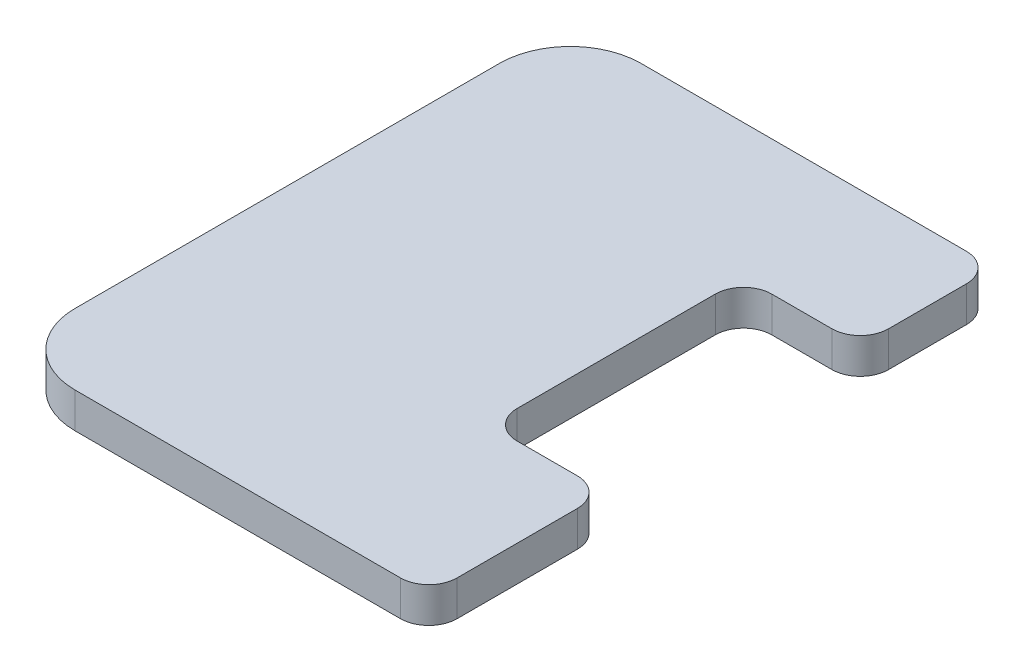
ISO-10303-21;
HEADER;
FILE_DESCRIPTION(('STEP AP214'),'2;1');
FILE_NAME('part.step','',(''),(''),'','','');
FILE_SCHEMA(('AUTOMOTIVE_DESIGN { 1 0 10303 214 1 1 1 1 }'));
ENDSEC;
DATA;
#1=APPLICATION_CONTEXT('core data for automotive mechanical design processes');
#2=APPLICATION_PROTOCOL_DEFINITION('international standard','automotive_design',2000,#1);
#3=PRODUCT_CONTEXT('',#1,'mechanical');
#4=PRODUCT('Part','Part','',(#3));
#5=PRODUCT_RELATED_PRODUCT_CATEGORY('part','',(#4));
#6=PRODUCT_DEFINITION_FORMATION('','',#4);
#7=PRODUCT_DEFINITION_CONTEXT('part definition',#1,'design');
#8=PRODUCT_DEFINITION('design','',#6,#7);
#9=PRODUCT_DEFINITION_SHAPE('','',#8);
#10=(LENGTH_UNIT() NAMED_UNIT(*) SI_UNIT(.MILLI.,.METRE.));
#11=(NAMED_UNIT(*) PLANE_ANGLE_UNIT() SI_UNIT($,.RADIAN.));
#12=(NAMED_UNIT(*) SI_UNIT($,.STERADIAN.) SOLID_ANGLE_UNIT());
#13=UNCERTAINTY_MEASURE_WITH_UNIT(LENGTH_MEASURE(1.E-05),#10,'distance_accuracy_value','');
#14=(GEOMETRIC_REPRESENTATION_CONTEXT(3) GLOBAL_UNCERTAINTY_ASSIGNED_CONTEXT((#13)) GLOBAL_UNIT_ASSIGNED_CONTEXT((#10,
#11,#12)) REPRESENTATION_CONTEXT('',''));
#15=CARTESIAN_POINT('',(0.,0.,0.));
#16=DIRECTION('',(0.,0.,1.));
#17=DIRECTION('',(1.,0.,0.));
#18=AXIS2_PLACEMENT_3D('',#15,#16,#17);
#19=CARTESIAN_POINT('',(19.05,3.175,25.4));
#20=DIRECTION('',(-1.,0.,0.));
#21=DIRECTION('',(0.,0.,1.));
#22=AXIS2_PLACEMENT_3D('',#19,#20,#21);
#23=PLANE('',#22);
#24=DIRECTION('',(0.,0.,-1.));
#25=VECTOR('',#24,1.);
#26=CARTESIAN_POINT('',(19.05,3.175,25.4));
#27=LINE('',#26,#25);
#28=CARTESIAN_POINT('',(19.05,3.175,22.86));
#29=VERTEX_POINT('',#28);
#30=CARTESIAN_POINT('',(19.05,3.175,12.065));
#31=VERTEX_POINT('',#30);
#32=EDGE_CURVE('E211',#29,#31,#27,.T.);
#33=ORIENTED_EDGE('',*,*,#32,.F.);
#34=DIRECTION('',(0.,-1.,0.));
#35=VECTOR('',#34,1.);
#36=CARTESIAN_POINT('',(19.05,3.175,22.86));
#37=LINE('',#36,#35);
#38=CARTESIAN_POINT('',(19.05,0.,22.86));
#39=VERTEX_POINT('',#38);
#40=EDGE_CURVE('E195',#29,#39,#37,.T.);
#41=ORIENTED_EDGE('',*,*,#40,.T.);
#42=DIRECTION('',(0.,0.,-1.));
#43=VECTOR('',#42,1.);
#44=CARTESIAN_POINT('',(19.05,0.,25.4));
#45=LINE('',#44,#43);
#46=CARTESIAN_POINT('',(19.05,0.,12.065));
#47=VERTEX_POINT('',#46);
#48=EDGE_CURVE('E208',#39,#47,#45,.T.);
#49=ORIENTED_EDGE('',*,*,#48,.T.);
#50=DIRECTION('',(0.,1.,0.));
#51=VECTOR('',#50,1.);
#52=CARTESIAN_POINT('',(19.05,3.175,12.065));
#53=LINE('',#52,#51);
#54=EDGE_CURVE('E214',#47,#31,#53,.T.);
#55=ORIENTED_EDGE('',*,*,#54,.T.);
#56=EDGE_LOOP('',(#33,#41,#49,#55));
#57=FACE_BOUND('',#56,.T.);
#58=ADVANCED_FACE('F48',(#57),#23,.F.);
#59=CARTESIAN_POINT('',(19.05,0.,-15.875));
#60=VERTEX_POINT('',#59);
#61=CARTESIAN_POINT('',(19.05,0.,-22.86));
#62=VERTEX_POINT('',#61);
#63=EDGE_CURVE('E222',#60,#62,#45,.T.);
#64=ORIENTED_EDGE('',*,*,#63,.T.);
#65=DIRECTION('',(0.,-1.,0.));
#66=VECTOR('',#65,1.);
#67=CARTESIAN_POINT('',(19.05,3.175,-22.86));
#68=LINE('',#67,#66);
#69=CARTESIAN_POINT('',(19.05,3.175,-22.86));
#70=VERTEX_POINT('',#69);
#71=EDGE_CURVE('E269',#62,#70,#68,.F.);
#72=ORIENTED_EDGE('',*,*,#71,.T.);
#73=CARTESIAN_POINT('',(19.05,3.175,-15.875));
#74=VERTEX_POINT('',#73);
#75=EDGE_CURVE('E239',#74,#70,#27,.T.);
#76=ORIENTED_EDGE('',*,*,#75,.F.);
#77=DIRECTION('',(0.,1.,0.));
#78=VECTOR('',#77,1.);
#79=CARTESIAN_POINT('',(19.05,3.175,-15.875));
#80=LINE('',#79,#78);
#81=EDGE_CURVE('E266',#74,#60,#80,.F.);
#82=ORIENTED_EDGE('',*,*,#81,.T.);
#83=EDGE_LOOP('',(#64,#72,#76,#82));
#84=FACE_BOUND('',#83,.T.);
#85=ADVANCED_FACE('F351',(#84),#23,.F.);
#86=CARTESIAN_POINT('',(-19.05,3.175,-25.4));
#87=DIRECTION('',(0.,0.,1.));
#88=DIRECTION('',(1.,0.,0.));
#89=AXIS2_PLACEMENT_3D('',#86,#87,#88);
#90=PLANE('',#89);
#91=DIRECTION('',(-1.,0.,0.));
#92=VECTOR('',#91,1.);
#93=CARTESIAN_POINT('',(-19.05,0.,-25.4));
#94=LINE('',#93,#92);
#95=CARTESIAN_POINT('',(16.51,0.,-25.4));
#96=VERTEX_POINT('',#95);
#97=CARTESIAN_POINT('',(-12.7,0.,-25.4));
#98=VERTEX_POINT('',#97);
#99=EDGE_CURVE('E221',#96,#98,#94,.T.);
#100=ORIENTED_EDGE('',*,*,#99,.T.);
#101=DIRECTION('',(0.,-1.,0.));
#102=VECTOR('',#101,1.);
#103=CARTESIAN_POINT('',(-12.7,3.175,-25.4));
#104=LINE('',#103,#102);
#105=CARTESIAN_POINT('',(-12.7,3.175,-25.4));
#106=VERTEX_POINT('',#105);
#107=EDGE_CURVE('E11',#98,#106,#104,.F.);
#108=ORIENTED_EDGE('',*,*,#107,.T.);
#109=DIRECTION('',(-1.,0.,0.));
#110=VECTOR('',#109,1.);
#111=CARTESIAN_POINT('',(-19.05,3.175,-25.4));
#112=LINE('',#111,#110);
#113=CARTESIAN_POINT('',(16.51,3.175,-25.4));
#114=VERTEX_POINT('',#113);
#115=EDGE_CURVE('E343',#114,#106,#112,.T.);
#116=ORIENTED_EDGE('',*,*,#115,.F.);
#117=DIRECTION('',(0.,-1.,0.));
#118=VECTOR('',#117,1.);
#119=CARTESIAN_POINT('',(16.51,3.175,-25.4));
#120=LINE('',#119,#118);
#121=EDGE_CURVE('E262',#114,#96,#120,.T.);
#122=ORIENTED_EDGE('',*,*,#121,.T.);
#123=EDGE_LOOP('',(#100,#108,#116,#122));
#124=FACE_BOUND('',#123,.T.);
#125=ADVANCED_FACE('F341',(#124),#90,.F.);
#126=CARTESIAN_POINT('',(-19.05,3.175,25.4));
#127=DIRECTION('',(1.,0.,0.));
#128=DIRECTION('',(0.,0.,-1.));
#129=AXIS2_PLACEMENT_3D('',#126,#127,#128);
#130=PLANE('',#129);
#131=DIRECTION('',(0.,0.,1.));
#132=VECTOR('',#131,1.);
#133=CARTESIAN_POINT('',(-19.05,0.,25.4));
#134=LINE('',#133,#132);
#135=CARTESIAN_POINT('',(-19.05,0.,-19.05));
#136=VERTEX_POINT('',#135);
#137=CARTESIAN_POINT('',(-19.05,0.,19.05));
#138=VERTEX_POINT('',#137);
#139=EDGE_CURVE('E226',#136,#138,#134,.T.);
#140=ORIENTED_EDGE('',*,*,#139,.T.);
#141=DIRECTION('',(0.,-1.,0.));
#142=VECTOR('',#141,1.);
#143=CARTESIAN_POINT('',(-19.05,3.175,19.05));
#144=LINE('',#143,#142);
#145=CARTESIAN_POINT('',(-19.05,3.175,19.05));
#146=VERTEX_POINT('',#145);
#147=EDGE_CURVE('E73',#138,#146,#144,.F.);
#148=ORIENTED_EDGE('',*,*,#147,.T.);
#149=DIRECTION('',(0.,0.,1.));
#150=VECTOR('',#149,1.);
#151=CARTESIAN_POINT('',(-19.05,3.175,25.4));
#152=LINE('',#151,#150);
#153=CARTESIAN_POINT('',(-19.05,3.175,-19.05));
#154=VERTEX_POINT('',#153);
#155=EDGE_CURVE('E328',#154,#146,#152,.T.);
#156=ORIENTED_EDGE('',*,*,#155,.F.);
#157=DIRECTION('',(0.,-1.,0.));
#158=VECTOR('',#157,1.);
#159=CARTESIAN_POINT('',(-19.05,3.175,-19.05));
#160=LINE('',#159,#158);
#161=EDGE_CURVE('E315',#154,#136,#160,.T.);
#162=ORIENTED_EDGE('',*,*,#161,.T.);
#163=EDGE_LOOP('',(#140,#148,#156,#162));
#164=FACE_BOUND('',#163,.T.);
#165=ADVANCED_FACE('F336',(#164),#130,.F.);
#166=CARTESIAN_POINT('',(-19.05,3.175,25.4));
#167=DIRECTION('',(0.,0.,-1.));
#168=DIRECTION('',(-1.,0.,0.));
#169=AXIS2_PLACEMENT_3D('',#166,#167,#168);
#170=PLANE('',#169);
#171=DIRECTION('',(1.,0.,0.));
#172=VECTOR('',#171,1.);
#173=CARTESIAN_POINT('',(-19.05,3.175,25.4));
#174=LINE('',#173,#172);
#175=CARTESIAN_POINT('',(-12.7,3.175,25.4));
#176=VERTEX_POINT('',#175);
#177=CARTESIAN_POINT('',(16.51,3.175,25.4));
#178=VERTEX_POINT('',#177);
#179=EDGE_CURVE('E231',#176,#178,#174,.T.);
#180=ORIENTED_EDGE('',*,*,#179,.F.);
#181=DIRECTION('',(0.,-1.,0.));
#182=VECTOR('',#181,1.);
#183=CARTESIAN_POINT('',(-12.7,3.175,25.4));
#184=LINE('',#183,#182);
#185=CARTESIAN_POINT('',(-12.7,0.,25.4));
#186=VERTEX_POINT('',#185);
#187=EDGE_CURVE('E305',#176,#186,#184,.T.);
#188=ORIENTED_EDGE('',*,*,#187,.T.);
#189=DIRECTION('',(1.,0.,0.));
#190=VECTOR('',#189,1.);
#191=CARTESIAN_POINT('',(-19.05,0.,25.4));
#192=LINE('',#191,#190);
#193=CARTESIAN_POINT('',(16.51,0.,25.4));
#194=VERTEX_POINT('',#193);
#195=EDGE_CURVE('E236',#186,#194,#192,.T.);
#196=ORIENTED_EDGE('',*,*,#195,.T.);
#197=DIRECTION('',(0.,-1.,0.));
#198=VECTOR('',#197,1.);
#199=CARTESIAN_POINT('',(16.51,3.175,25.4));
#200=LINE('',#199,#198);
#201=EDGE_CURVE('E197',#194,#178,#200,.F.);
#202=ORIENTED_EDGE('',*,*,#201,.T.);
#203=EDGE_LOOP('',(#180,#188,#196,#202));
#204=FACE_BOUND('',#203,.T.);
#205=ADVANCED_FACE('F332',(#204),#170,.F.);
#206=CARTESIAN_POINT('',(0.,3.175,0.));
#207=DIRECTION('',(0.,-1.,0.));
#208=DIRECTION('',(0.,0.,-1.));
#209=AXIS2_PLACEMENT_3D('',#206,#207,#208);
#210=PLANE('',#209);
#211=ORIENTED_EDGE('',*,*,#155,.T.);
#212=CARTESIAN_POINT('',(-12.7,3.175,19.05));
#213=DIRECTION('',(0.,-1.,0.));
#214=DIRECTION('',(0.,0.,-1.));
#215=AXIS2_PLACEMENT_3D('',#212,#213,#214);
#216=CIRCLE('',#215,6.35);
#217=EDGE_CURVE('E57',#146,#176,#216,.F.);
#218=ORIENTED_EDGE('',*,*,#217,.T.);
#219=ORIENTED_EDGE('',*,*,#179,.T.);
#220=CARTESIAN_POINT('',(16.51,3.175,22.86));
#221=DIRECTION('',(0.,-1.,0.));
#222=DIRECTION('',(0.,0.,-1.));
#223=AXIS2_PLACEMENT_3D('',#220,#221,#222);
#224=CIRCLE('',#223,2.54);
#225=EDGE_CURVE('E259',#178,#29,#224,.F.);
#226=ORIENTED_EDGE('',*,*,#225,.T.);
#227=ORIENTED_EDGE('',*,*,#32,.T.);
#228=CARTESIAN_POINT('',(16.51,3.175,12.065));
#229=DIRECTION('',(0.,-1.,0.));
#230=DIRECTION('',(0.,0.,-1.));
#231=AXIS2_PLACEMENT_3D('',#228,#229,#230);
#232=CIRCLE('',#231,2.54);
#233=CARTESIAN_POINT('',(16.51,3.175,9.525));
#234=VERTEX_POINT('',#233);
#235=EDGE_CURVE('E253',#31,#234,#232,.F.);
#236=ORIENTED_EDGE('',*,*,#235,.T.);
#237=DIRECTION('',(1.,0.,0.));
#238=VECTOR('',#237,1.);
#239=CARTESIAN_POINT('',(19.05,3.175,9.525));
#240=LINE('',#239,#238);
#241=CARTESIAN_POINT('',(11.1125,3.175,9.525));
#242=VERTEX_POINT('',#241);
#243=EDGE_CURVE('E369',#242,#234,#240,.T.);
#244=ORIENTED_EDGE('',*,*,#243,.F.);
#245=CARTESIAN_POINT('',(11.1125,3.175,6.985));
#246=DIRECTION('',(0.,-1.,0.));
#247=DIRECTION('',(0.,0.,-1.));
#248=AXIS2_PLACEMENT_3D('',#245,#246,#247);
#249=CIRCLE('',#248,2.54);
#250=CARTESIAN_POINT('',(8.57249999999999,3.175,6.985));
#251=VERTEX_POINT('',#250);
#252=EDGE_CURVE('E293',#242,#251,#249,.T.);
#253=ORIENTED_EDGE('',*,*,#252,.T.);
#254=DIRECTION('',(0.,0.,1.));
#255=VECTOR('',#254,1.);
#256=CARTESIAN_POINT('',(8.57249999999999,3.175,9.525));
#257=LINE('',#256,#255);
#258=CARTESIAN_POINT('',(8.57249999999999,3.175,-10.795));
#259=VERTEX_POINT('',#258);
#260=EDGE_CURVE('E376',#259,#251,#257,.T.);
#261=ORIENTED_EDGE('',*,*,#260,.F.);
#262=CARTESIAN_POINT('',(11.1125,3.175,-10.795));
#263=DIRECTION('',(0.,-1.,0.));
#264=DIRECTION('',(0.,0.,-1.));
#265=AXIS2_PLACEMENT_3D('',#262,#263,#264);
#266=CIRCLE('',#265,2.54);
#267=CARTESIAN_POINT('',(11.1125,3.175,-13.335));
#268=VERTEX_POINT('',#267);
#269=EDGE_CURVE('E299',#259,#268,#266,.T.);
#270=ORIENTED_EDGE('',*,*,#269,.T.);
#271=DIRECTION('',(-1.,0.,0.));
#272=VECTOR('',#271,1.);
#273=CARTESIAN_POINT('',(8.57249999999999,3.175,-13.335));
#274=LINE('',#273,#272);
#275=CARTESIAN_POINT('',(16.51,3.175,-13.335));
#276=VERTEX_POINT('',#275);
#277=EDGE_CURVE('E381',#276,#268,#274,.T.);
#278=ORIENTED_EDGE('',*,*,#277,.F.);
#279=CARTESIAN_POINT('',(16.51,3.175,-15.875));
#280=DIRECTION('',(0.,-1.,0.));
#281=DIRECTION('',(0.,0.,-1.));
#282=AXIS2_PLACEMENT_3D('',#279,#280,#281);
#283=CIRCLE('',#282,2.54);
#284=EDGE_CURVE('E250',#276,#74,#283,.F.);
#285=ORIENTED_EDGE('',*,*,#284,.T.);
#286=ORIENTED_EDGE('',*,*,#75,.T.);
#287=CARTESIAN_POINT('',(16.51,3.175,-22.86));
#288=DIRECTION('',(0.,-1.,0.));
#289=DIRECTION('',(0.,0.,-1.));
#290=AXIS2_PLACEMENT_3D('',#287,#288,#289);
#291=CIRCLE('',#290,2.54);
#292=EDGE_CURVE('E256',#70,#114,#291,.F.);
#293=ORIENTED_EDGE('',*,*,#292,.T.);
#294=ORIENTED_EDGE('',*,*,#115,.T.);
#295=CARTESIAN_POINT('',(-12.7,3.175,-19.05));
#296=DIRECTION('',(0.,-1.,0.));
#297=DIRECTION('',(0.,0.,-1.));
#298=AXIS2_PLACEMENT_3D('',#295,#296,#297);
#299=CIRCLE('',#298,6.35);
#300=EDGE_CURVE('E321',#106,#154,#299,.F.);
#301=ORIENTED_EDGE('',*,*,#300,.T.);
#302=EDGE_LOOP('',(#211,#218,#219,#226,#227,#236,#244,#253,#261,#270,#278,#285,#286,#293,#294,#301));
#303=FACE_BOUND('',#302,.T.);
#304=ADVANCED_FACE('F327',(#303),#210,.F.);
#305=CARTESIAN_POINT('',(0.,0.,0.));
#306=DIRECTION('',(0.,-1.,0.));
#307=DIRECTION('',(0.,0.,-1.));
#308=AXIS2_PLACEMENT_3D('',#305,#306,#307);
#309=PLANE('',#308);
#310=ORIENTED_EDGE('',*,*,#195,.F.);
#311=CARTESIAN_POINT('',(-12.7,0.,19.05));
#312=DIRECTION('',(0.,-1.,0.));
#313=DIRECTION('',(0.,0.,-1.));
#314=AXIS2_PLACEMENT_3D('',#311,#312,#313);
#315=CIRCLE('',#314,6.35);
#316=EDGE_CURVE('E312',#186,#138,#315,.T.);
#317=ORIENTED_EDGE('',*,*,#316,.T.);
#318=ORIENTED_EDGE('',*,*,#139,.F.);
#319=CARTESIAN_POINT('',(-12.7,0.,-19.05));
#320=DIRECTION('',(0.,-1.,0.));
#321=DIRECTION('',(0.,0.,-1.));
#322=AXIS2_PLACEMENT_3D('',#319,#320,#321);
#323=CIRCLE('',#322,6.35);
#324=EDGE_CURVE('E309',#136,#98,#323,.T.);
#325=ORIENTED_EDGE('',*,*,#324,.T.);
#326=ORIENTED_EDGE('',*,*,#99,.F.);
#327=CARTESIAN_POINT('',(16.51,0.,-22.86));
#328=DIRECTION('',(0.,-1.,0.));
#329=DIRECTION('',(0.,0.,-1.));
#330=AXIS2_PLACEMENT_3D('',#327,#328,#329);
#331=CIRCLE('',#330,2.54);
#332=EDGE_CURVE('E202',#96,#62,#331,.T.);
#333=ORIENTED_EDGE('',*,*,#332,.T.);
#334=ORIENTED_EDGE('',*,*,#63,.F.);
#335=CARTESIAN_POINT('',(16.51,0.,-15.875));
#336=DIRECTION('',(0.,-1.,0.));
#337=DIRECTION('',(0.,0.,-1.));
#338=AXIS2_PLACEMENT_3D('',#335,#336,#337);
#339=CIRCLE('',#338,2.54);
#340=CARTESIAN_POINT('',(16.51,0.,-13.335));
#341=VERTEX_POINT('',#340);
#342=EDGE_CURVE('E213',#60,#341,#339,.T.);
#343=ORIENTED_EDGE('',*,*,#342,.T.);
#344=DIRECTION('',(-1.,0.,0.));
#345=VECTOR('',#344,1.);
#346=CARTESIAN_POINT('',(8.57249999999999,0.,-13.335));
#347=LINE('',#346,#345);
#348=CARTESIAN_POINT('',(11.1125,0.,-13.335));
#349=VERTEX_POINT('',#348);
#350=EDGE_CURVE('E360',#341,#349,#347,.T.);
#351=ORIENTED_EDGE('',*,*,#350,.T.);
#352=CARTESIAN_POINT('',(11.1125,0.,-10.795));
#353=DIRECTION('',(0.,-1.,0.));
#354=DIRECTION('',(0.,0.,-1.));
#355=AXIS2_PLACEMENT_3D('',#352,#353,#354);
#356=CIRCLE('',#355,2.54);
#357=CARTESIAN_POINT('',(8.57249999999999,0.,-10.795));
#358=VERTEX_POINT('',#357);
#359=EDGE_CURVE('E302',#349,#358,#356,.F.);
#360=ORIENTED_EDGE('',*,*,#359,.T.);
#361=DIRECTION('',(0.,0.,1.));
#362=VECTOR('',#361,1.);
#363=CARTESIAN_POINT('',(8.57249999999999,0.,9.525));
#364=LINE('',#363,#362);
#365=CARTESIAN_POINT('',(8.57249999999999,0.,6.985));
#366=VERTEX_POINT('',#365);
#367=EDGE_CURVE('E368',#358,#366,#364,.T.);
#368=ORIENTED_EDGE('',*,*,#367,.T.);
#369=CARTESIAN_POINT('',(11.1125,0.,6.985));
#370=DIRECTION('',(0.,-1.,0.));
#371=DIRECTION('',(0.,0.,-1.));
#372=AXIS2_PLACEMENT_3D('',#369,#370,#371);
#373=CIRCLE('',#372,2.54);
#374=CARTESIAN_POINT('',(11.1125,0.,9.525));
#375=VERTEX_POINT('',#374);
#376=EDGE_CURVE('E296',#366,#375,#373,.F.);
#377=ORIENTED_EDGE('',*,*,#376,.T.);
#378=DIRECTION('',(1.,0.,0.));
#379=VECTOR('',#378,1.);
#380=CARTESIAN_POINT('',(19.05,0.,9.525));
#381=LINE('',#380,#379);
#382=CARTESIAN_POINT('',(16.51,0.,9.525));
#383=VERTEX_POINT('',#382);
#384=EDGE_CURVE('E229',#375,#383,#381,.T.);
#385=ORIENTED_EDGE('',*,*,#384,.T.);
#386=CARTESIAN_POINT('',(16.51,0.,12.065));
#387=DIRECTION('',(0.,-1.,0.));
#388=DIRECTION('',(0.,0.,-1.));
#389=AXIS2_PLACEMENT_3D('',#386,#387,#388);
#390=CIRCLE('',#389,2.54);
#391=EDGE_CURVE('E219',#383,#47,#390,.T.);
#392=ORIENTED_EDGE('',*,*,#391,.T.);
#393=ORIENTED_EDGE('',*,*,#48,.F.);
#394=CARTESIAN_POINT('',(16.51,0.,22.86));
#395=DIRECTION('',(0.,-1.,0.));
#396=DIRECTION('',(0.,0.,-1.));
#397=AXIS2_PLACEMENT_3D('',#394,#395,#396);
#398=CIRCLE('',#397,2.54);
#399=EDGE_CURVE('E191',#39,#194,#398,.T.);
#400=ORIENTED_EDGE('',*,*,#399,.T.);
#401=EDGE_LOOP('',(#310,#317,#318,#325,#326,#333,#334,#343,#351,#360,#368,#377,#385,#392,#393,#400));
#402=FACE_BOUND('',#401,.T.);
#403=ADVANCED_FACE('F216',(#402),#309,.T.);
#404=CARTESIAN_POINT('',(19.05,0.,9.525));
#405=DIRECTION('',(0.,0.,1.));
#406=DIRECTION('',(1.,0.,0.));
#407=AXIS2_PLACEMENT_3D('',#404,#405,#406);
#408=PLANE('',#407);
#409=ORIENTED_EDGE('',*,*,#243,.T.);
#410=DIRECTION('',(0.,1.,0.));
#411=VECTOR('',#410,1.);
#412=CARTESIAN_POINT('',(16.51,0.,9.525));
#413=LINE('',#412,#411);
#414=EDGE_CURVE('E276',#234,#383,#413,.F.);
#415=ORIENTED_EDGE('',*,*,#414,.T.);
#416=ORIENTED_EDGE('',*,*,#384,.F.);
#417=DIRECTION('',(0.,1.,0.));
#418=VECTOR('',#417,1.);
#419=CARTESIAN_POINT('',(11.1125,3.175,9.525));
#420=LINE('',#419,#418);
#421=EDGE_CURVE('E272',#375,#242,#420,.T.);
#422=ORIENTED_EDGE('',*,*,#421,.T.);
#423=EDGE_LOOP('',(#409,#415,#416,#422));
#424=FACE_BOUND('',#423,.T.);
#425=ADVANCED_FACE('F396',(#424),#408,.F.);
#426=CARTESIAN_POINT('',(8.57249999999999,0.,9.525));
#427=DIRECTION('',(-1.,0.,0.));
#428=DIRECTION('',(0.,0.,1.));
#429=AXIS2_PLACEMENT_3D('',#426,#427,#428);
#430=PLANE('',#429);
#431=ORIENTED_EDGE('',*,*,#260,.T.);
#432=DIRECTION('',(0.,1.,0.));
#433=VECTOR('',#432,1.);
#434=CARTESIAN_POINT('',(8.57249999999999,0.,6.985));
#435=LINE('',#434,#433);
#436=EDGE_CURVE('E283',#251,#366,#435,.F.);
#437=ORIENTED_EDGE('',*,*,#436,.T.);
#438=ORIENTED_EDGE('',*,*,#367,.F.);
#439=DIRECTION('',(0.,1.,0.));
#440=VECTOR('',#439,1.);
#441=CARTESIAN_POINT('',(8.57249999999999,3.175,-10.795));
#442=LINE('',#441,#440);
#443=EDGE_CURVE('E279',#358,#259,#442,.T.);
#444=ORIENTED_EDGE('',*,*,#443,.T.);
#445=EDGE_LOOP('',(#431,#437,#438,#444));
#446=FACE_BOUND('',#445,.T.);
#447=ADVANCED_FACE('F426',(#446),#430,.F.);
#448=CARTESIAN_POINT('',(8.57249999999999,0.,-13.335));
#449=DIRECTION('',(0.,0.,-1.));
#450=DIRECTION('',(-1.,0.,0.));
#451=AXIS2_PLACEMENT_3D('',#448,#449,#450);
#452=PLANE('',#451);
#453=ORIENTED_EDGE('',*,*,#350,.F.);
#454=DIRECTION('',(0.,1.,0.));
#455=VECTOR('',#454,1.);
#456=CARTESIAN_POINT('',(16.51,0.,-13.335));
#457=LINE('',#456,#455);
#458=EDGE_CURVE('E289',#341,#276,#457,.T.);
#459=ORIENTED_EDGE('',*,*,#458,.T.);
#460=ORIENTED_EDGE('',*,*,#277,.T.);
#461=DIRECTION('',(0.,1.,0.));
#462=VECTOR('',#461,1.);
#463=CARTESIAN_POINT('',(11.1125,0.,-13.335));
#464=LINE('',#463,#462);
#465=EDGE_CURVE('E286',#268,#349,#464,.F.);
#466=ORIENTED_EDGE('',*,*,#465,.T.);
#467=EDGE_LOOP('',(#453,#459,#460,#466));
#468=FACE_BOUND('',#467,.T.);
#469=ADVANCED_FACE('F363',(#468),#452,.F.);
#470=CARTESIAN_POINT('',(16.51,3.175,22.86));
#471=DIRECTION('',(0.,-1.,0.));
#472=DIRECTION('',(0.,0.,-1.));
#473=AXIS2_PLACEMENT_3D('',#470,#471,#472);
#474=CYLINDRICAL_SURFACE('',#473,2.54);
#475=ORIENTED_EDGE('',*,*,#225,.F.);
#476=ORIENTED_EDGE('',*,*,#201,.F.);
#477=ORIENTED_EDGE('',*,*,#399,.F.);
#478=ORIENTED_EDGE('',*,*,#40,.F.);
#479=EDGE_LOOP('',(#475,#476,#477,#478));
#480=FACE_BOUND('',#479,.T.);
#481=ADVANCED_FACE('F194',(#480),#474,.T.);
#482=CARTESIAN_POINT('',(16.51,3.175,-22.86));
#483=DIRECTION('',(0.,-1.,0.));
#484=DIRECTION('',(0.,0.,-1.));
#485=AXIS2_PLACEMENT_3D('',#482,#483,#484);
#486=CYLINDRICAL_SURFACE('',#485,2.54);
#487=ORIENTED_EDGE('',*,*,#292,.F.);
#488=ORIENTED_EDGE('',*,*,#71,.F.);
#489=ORIENTED_EDGE('',*,*,#332,.F.);
#490=ORIENTED_EDGE('',*,*,#121,.F.);
#491=EDGE_LOOP('',(#487,#488,#489,#490));
#492=FACE_BOUND('',#491,.T.);
#493=ADVANCED_FACE('F346',(#492),#486,.T.);
#494=CARTESIAN_POINT('',(16.51,3.175,12.065));
#495=DIRECTION('',(0.,1.,0.));
#496=DIRECTION('',(0.,0.,1.));
#497=AXIS2_PLACEMENT_3D('',#494,#495,#496);
#498=CYLINDRICAL_SURFACE('',#497,2.54);
#499=ORIENTED_EDGE('',*,*,#391,.F.);
#500=ORIENTED_EDGE('',*,*,#414,.F.);
#501=ORIENTED_EDGE('',*,*,#235,.F.);
#502=ORIENTED_EDGE('',*,*,#54,.F.);
#503=EDGE_LOOP('',(#499,#500,#501,#502));
#504=FACE_BOUND('',#503,.T.);
#505=ADVANCED_FACE('F399',(#504),#498,.T.);
#506=CARTESIAN_POINT('',(11.1125,0.,6.985));
#507=DIRECTION('',(0.,-1.,0.));
#508=DIRECTION('',(0.,0.,-1.));
#509=AXIS2_PLACEMENT_3D('',#506,#507,#508);
#510=CYLINDRICAL_SURFACE('',#509,2.54);
#511=ORIENTED_EDGE('',*,*,#376,.F.);
#512=ORIENTED_EDGE('',*,*,#436,.F.);
#513=ORIENTED_EDGE('',*,*,#252,.F.);
#514=ORIENTED_EDGE('',*,*,#421,.F.);
#515=EDGE_LOOP('',(#511,#512,#513,#514));
#516=FACE_BOUND('',#515,.T.);
#517=ADVANCED_FACE('F401',(#516),#510,.F.);
#518=CARTESIAN_POINT('',(16.51,0.,-15.875));
#519=DIRECTION('',(0.,1.,0.));
#520=DIRECTION('',(0.,0.,1.));
#521=AXIS2_PLACEMENT_3D('',#518,#519,#520);
#522=CYLINDRICAL_SURFACE('',#521,2.54);
#523=ORIENTED_EDGE('',*,*,#342,.F.);
#524=ORIENTED_EDGE('',*,*,#81,.F.);
#525=ORIENTED_EDGE('',*,*,#284,.F.);
#526=ORIENTED_EDGE('',*,*,#458,.F.);
#527=EDGE_LOOP('',(#523,#524,#525,#526));
#528=FACE_BOUND('',#527,.T.);
#529=ADVANCED_FACE('F356',(#528),#522,.T.);
#530=CARTESIAN_POINT('',(11.1125,0.,-10.795));
#531=DIRECTION('',(0.,-1.,0.));
#532=DIRECTION('',(0.,0.,-1.));
#533=AXIS2_PLACEMENT_3D('',#530,#531,#532);
#534=CYLINDRICAL_SURFACE('',#533,2.54);
#535=ORIENTED_EDGE('',*,*,#359,.F.);
#536=ORIENTED_EDGE('',*,*,#465,.F.);
#537=ORIENTED_EDGE('',*,*,#269,.F.);
#538=ORIENTED_EDGE('',*,*,#443,.F.);
#539=EDGE_LOOP('',(#535,#536,#537,#538));
#540=FACE_BOUND('',#539,.T.);
#541=ADVANCED_FACE('F447',(#540),#534,.F.);
#542=CARTESIAN_POINT('',(-12.7,3.175,19.05));
#543=DIRECTION('',(0.,-1.,0.));
#544=DIRECTION('',(0.,0.,-1.));
#545=AXIS2_PLACEMENT_3D('',#542,#543,#544);
#546=CYLINDRICAL_SURFACE('',#545,6.35);
#547=ORIENTED_EDGE('',*,*,#217,.F.);
#548=ORIENTED_EDGE('',*,*,#147,.F.);
#549=ORIENTED_EDGE('',*,*,#316,.F.);
#550=ORIENTED_EDGE('',*,*,#187,.F.);
#551=EDGE_LOOP('',(#547,#548,#549,#550));
#552=FACE_BOUND('',#551,.T.);
#553=ADVANCED_FACE('F334',(#552),#546,.T.);
#554=CARTESIAN_POINT('',(-12.7,3.175,-19.05));
#555=DIRECTION('',(0.,-1.,0.));
#556=DIRECTION('',(0.,0.,-1.));
#557=AXIS2_PLACEMENT_3D('',#554,#555,#556);
#558=CYLINDRICAL_SURFACE('',#557,6.35);
#559=ORIENTED_EDGE('',*,*,#300,.F.);
#560=ORIENTED_EDGE('',*,*,#107,.F.);
#561=ORIENTED_EDGE('',*,*,#324,.F.);
#562=ORIENTED_EDGE('',*,*,#161,.F.);
#563=EDGE_LOOP('',(#559,#560,#561,#562));
#564=FACE_BOUND('',#563,.T.);
#565=ADVANCED_FACE('F50',(#564),#558,.T.);
#566=CLOSED_SHELL('',(#58,#85,#125,#165,#205,#304,#403,#425,#447,#469,#481,#493,#505,#517,#529,
#541,#553,#565));
#567=MANIFOLD_SOLID_BREP('B2',#566);
#568=ADVANCED_BREP_SHAPE_REPRESENTATION('',(#18,#567),#14);
#569=SHAPE_DEFINITION_REPRESENTATION(#9,#568);
ENDSEC;
END-ISO-10303-21;
